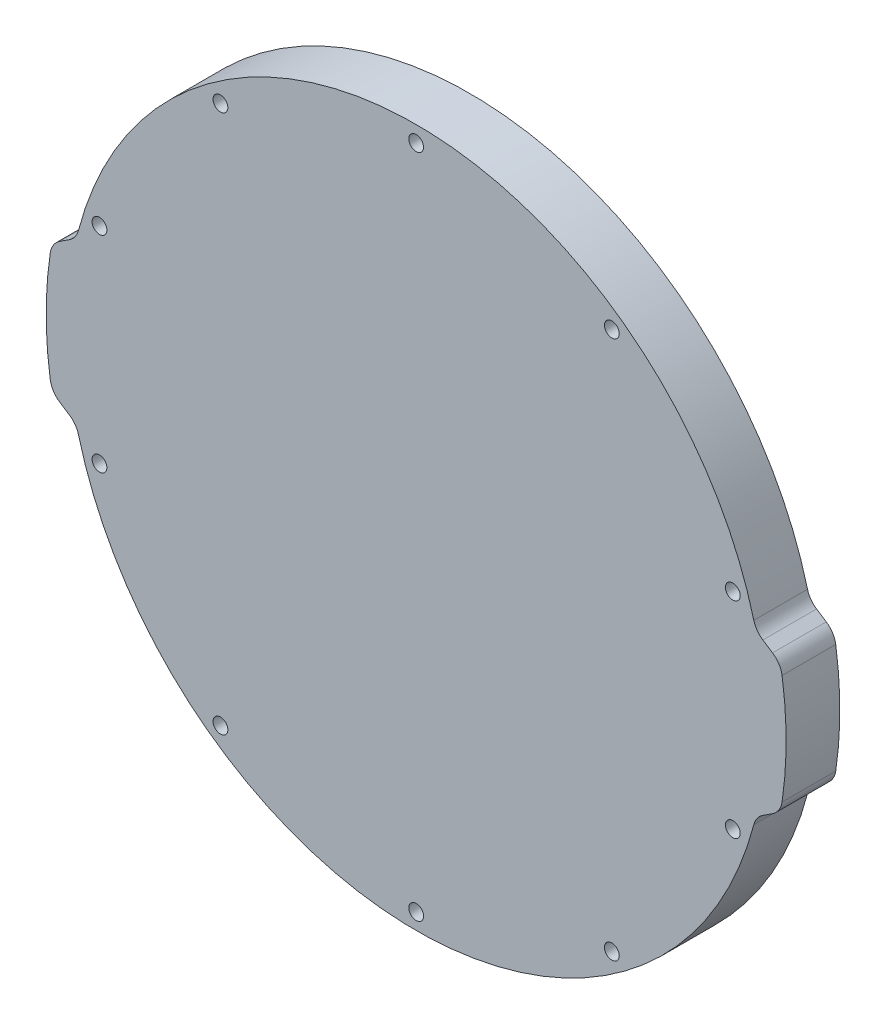
ISO-10303-21;
HEADER;
FILE_DESCRIPTION(('STEP AP214'),'2;1');
FILE_NAME('part.step','',(''),(''),'','','');
FILE_SCHEMA(('AUTOMOTIVE_DESIGN { 1 0 10303 214 1 1 1 1 }'));
ENDSEC;
DATA;
#1=APPLICATION_CONTEXT('core data for automotive mechanical design processes');
#2=APPLICATION_PROTOCOL_DEFINITION('international standard','automotive_design',2000,#1);
#3=PRODUCT_CONTEXT('',#1,'mechanical');
#4=PRODUCT('Part','Part','',(#3));
#5=PRODUCT_RELATED_PRODUCT_CATEGORY('part','',(#4));
#6=PRODUCT_DEFINITION_FORMATION('','',#4);
#7=PRODUCT_DEFINITION_CONTEXT('part definition',#1,'design');
#8=PRODUCT_DEFINITION('design','',#6,#7);
#9=PRODUCT_DEFINITION_SHAPE('','',#8);
#10=(LENGTH_UNIT() NAMED_UNIT(*) SI_UNIT(.MILLI.,.METRE.));
#11=(NAMED_UNIT(*) PLANE_ANGLE_UNIT() SI_UNIT($,.RADIAN.));
#12=(NAMED_UNIT(*) SI_UNIT($,.STERADIAN.) SOLID_ANGLE_UNIT());
#13=UNCERTAINTY_MEASURE_WITH_UNIT(LENGTH_MEASURE(1.E-05),#10,'distance_accuracy_value','');
#14=(GEOMETRIC_REPRESENTATION_CONTEXT(3) GLOBAL_UNCERTAINTY_ASSIGNED_CONTEXT((#13)) GLOBAL_UNIT_ASSIGNED_CONTEXT((#10,
#11,#12)) REPRESENTATION_CONTEXT('',''));
#15=CARTESIAN_POINT('',(0.,0.,0.));
#16=DIRECTION('',(0.,0.,1.));
#17=DIRECTION('',(1.,0.,0.));
#18=AXIS2_PLACEMENT_3D('',#15,#16,#17);
#19=CARTESIAN_POINT('',(0.,78.74,6.35));
#20=DIRECTION('',(0.,0.,-1.));
#21=DIRECTION('',(-1.,0.,0.));
#22=AXIS2_PLACEMENT_3D('',#19,#20,#21);
#23=CYLINDRICAL_SURFACE('',#22,1.75);
#24=CARTESIAN_POINT('',(0.,78.74,6.35));
#25=DIRECTION('',(0.,0.,1.));
#26=DIRECTION('',(1.,0.,0.));
#27=AXIS2_PLACEMENT_3D('',#24,#25,#26);
#28=CIRCLE('',#27,1.75);
#29=CARTESIAN_POINT('',(1.75,78.74,6.35));
#30=VERTEX_POINT('',#29);
#31=EDGE_CURVE('E242',#30,#30,#28,.T.);
#32=ORIENTED_EDGE('',*,*,#31,.T.);
#33=EDGE_LOOP('',(#32));
#34=FACE_BOUND('',#33,.T.);
#35=CARTESIAN_POINT('',(0.,78.74,-6.35));
#36=DIRECTION('',(0.,0.,1.));
#37=DIRECTION('',(1.,0.,0.));
#38=AXIS2_PLACEMENT_3D('',#35,#36,#37);
#39=CIRCLE('',#38,1.75);
#40=CARTESIAN_POINT('',(1.75,78.74,-6.35));
#41=VERTEX_POINT('',#40);
#42=EDGE_CURVE('E238',#41,#41,#39,.T.);
#43=ORIENTED_EDGE('',*,*,#42,.F.);
#44=EDGE_LOOP('',(#43));
#45=FACE_BOUND('',#44,.T.);
#46=ADVANCED_FACE('F65',(#34,#45),#23,.F.);
#47=CARTESIAN_POINT('',(46.2822107655093,63.7019981370834,6.35));
#48=DIRECTION('',(0.,0.,-1.));
#49=DIRECTION('',(-1.,0.,0.));
#50=AXIS2_PLACEMENT_3D('',#47,#48,#49);
#51=CYLINDRICAL_SURFACE('',#50,1.75000000000012);
#52=CARTESIAN_POINT('',(46.2822107655093,63.7019981370834,6.35));
#53=DIRECTION('',(0.,0.,1.));
#54=DIRECTION('',(1.,0.,0.));
#55=AXIS2_PLACEMENT_3D('',#52,#53,#54);
#56=CIRCLE('',#55,1.75000000000012);
#57=CARTESIAN_POINT('',(48.0322107655095,63.7019981370834,6.35));
#58=VERTEX_POINT('',#57);
#59=EDGE_CURVE('E349',#58,#58,#56,.T.);
#60=ORIENTED_EDGE('',*,*,#59,.T.);
#61=EDGE_LOOP('',(#60));
#62=FACE_BOUND('',#61,.T.);
#63=CARTESIAN_POINT('',(46.2822107655093,63.7019981370834,-6.35));
#64=DIRECTION('',(0.,0.,1.));
#65=DIRECTION('',(1.,0.,0.));
#66=AXIS2_PLACEMENT_3D('',#63,#64,#65);
#67=CIRCLE('',#66,1.75000000000012);
#68=CARTESIAN_POINT('',(48.0322107655095,63.7019981370834,-6.35));
#69=VERTEX_POINT('',#68);
#70=EDGE_CURVE('E235',#69,#69,#67,.T.);
#71=ORIENTED_EDGE('',*,*,#70,.F.);
#72=EDGE_LOOP('',(#71));
#73=FACE_BOUND('',#72,.T.);
#74=ADVANCED_FACE('F421',(#62,#73),#51,.F.);
#75=CARTESIAN_POINT('',(74.8861900930804,24.3319981370834,6.35));
#76=DIRECTION('',(0.,0.,-1.));
#77=DIRECTION('',(-1.,0.,0.));
#78=AXIS2_PLACEMENT_3D('',#75,#76,#77);
#79=CYLINDRICAL_SURFACE('',#78,1.7500000000002);
#80=CARTESIAN_POINT('',(74.8861900930804,24.3319981370834,6.35));
#81=DIRECTION('',(0.,0.,1.));
#82=DIRECTION('',(1.,0.,0.));
#83=AXIS2_PLACEMENT_3D('',#80,#81,#82);
#84=CIRCLE('',#83,1.7500000000002);
#85=CARTESIAN_POINT('',(76.6361900930806,24.3319981370834,6.35));
#86=VERTEX_POINT('',#85);
#87=EDGE_CURVE('E346',#86,#86,#84,.T.);
#88=ORIENTED_EDGE('',*,*,#87,.T.);
#89=EDGE_LOOP('',(#88));
#90=FACE_BOUND('',#89,.T.);
#91=CARTESIAN_POINT('',(74.8861900930804,24.3319981370834,-6.35));
#92=DIRECTION('',(0.,0.,1.));
#93=DIRECTION('',(1.,0.,0.));
#94=AXIS2_PLACEMENT_3D('',#91,#92,#93);
#95=CIRCLE('',#94,1.7500000000002);
#96=CARTESIAN_POINT('',(76.6361900930806,24.3319981370834,-6.35));
#97=VERTEX_POINT('',#96);
#98=EDGE_CURVE('E232',#97,#97,#95,.T.);
#99=ORIENTED_EDGE('',*,*,#98,.F.);
#100=EDGE_LOOP('',(#99));
#101=FACE_BOUND('',#100,.T.);
#102=ADVANCED_FACE('F427',(#90,#101),#79,.F.);
#103=CARTESIAN_POINT('',(74.8861900930804,-24.3319981370834,6.35));
#104=DIRECTION('',(0.,0.,-1.));
#105=DIRECTION('',(-1.,0.,0.));
#106=AXIS2_PLACEMENT_3D('',#103,#104,#105);
#107=CYLINDRICAL_SURFACE('',#106,1.75000000000031);
#108=CARTESIAN_POINT('',(74.8861900930804,-24.3319981370834,6.35));
#109=DIRECTION('',(0.,0.,1.));
#110=DIRECTION('',(1.,0.,0.));
#111=AXIS2_PLACEMENT_3D('',#108,#109,#110);
#112=CIRCLE('',#111,1.75000000000031);
#113=CARTESIAN_POINT('',(76.6361900930807,-24.3319981370834,6.35));
#114=VERTEX_POINT('',#113);
#115=EDGE_CURVE('E343',#114,#114,#112,.T.);
#116=ORIENTED_EDGE('',*,*,#115,.T.);
#117=EDGE_LOOP('',(#116));
#118=FACE_BOUND('',#117,.T.);
#119=CARTESIAN_POINT('',(74.8861900930804,-24.3319981370834,-6.35));
#120=DIRECTION('',(0.,0.,1.));
#121=DIRECTION('',(1.,0.,0.));
#122=AXIS2_PLACEMENT_3D('',#119,#120,#121);
#123=CIRCLE('',#122,1.75000000000031);
#124=CARTESIAN_POINT('',(76.6361900930807,-24.3319981370834,-6.35));
#125=VERTEX_POINT('',#124);
#126=EDGE_CURVE('E229',#125,#125,#123,.T.);
#127=ORIENTED_EDGE('',*,*,#126,.F.);
#128=EDGE_LOOP('',(#127));
#129=FACE_BOUND('',#128,.T.);
#130=ADVANCED_FACE('F436',(#118,#129),#107,.F.);
#131=CARTESIAN_POINT('',(46.2822107655093,-63.7019981370834,6.35));
#132=DIRECTION('',(0.,0.,-1.));
#133=DIRECTION('',(-1.,0.,0.));
#134=AXIS2_PLACEMENT_3D('',#131,#132,#133);
#135=CYLINDRICAL_SURFACE('',#134,1.7500000000004);
#136=CARTESIAN_POINT('',(46.2822107655093,-63.7019981370834,6.35));
#137=DIRECTION('',(0.,0.,1.));
#138=DIRECTION('',(1.,0.,0.));
#139=AXIS2_PLACEMENT_3D('',#136,#137,#138);
#140=CIRCLE('',#139,1.7500000000004);
#141=CARTESIAN_POINT('',(48.0322107655098,-63.7019981370834,6.35));
#142=VERTEX_POINT('',#141);
#143=EDGE_CURVE('E340',#142,#142,#140,.T.);
#144=ORIENTED_EDGE('',*,*,#143,.T.);
#145=EDGE_LOOP('',(#144));
#146=FACE_BOUND('',#145,.T.);
#147=CARTESIAN_POINT('',(46.2822107655093,-63.7019981370834,-6.35));
#148=DIRECTION('',(0.,0.,1.));
#149=DIRECTION('',(1.,0.,0.));
#150=AXIS2_PLACEMENT_3D('',#147,#148,#149);
#151=CIRCLE('',#150,1.7500000000004);
#152=CARTESIAN_POINT('',(48.0322107655098,-63.7019981370834,-6.35));
#153=VERTEX_POINT('',#152);
#154=EDGE_CURVE('E226',#153,#153,#151,.T.);
#155=ORIENTED_EDGE('',*,*,#154,.F.);
#156=EDGE_LOOP('',(#155));
#157=FACE_BOUND('',#156,.T.);
#158=ADVANCED_FACE('F440',(#146,#157),#135,.F.);
#159=CARTESIAN_POINT('',(0.,-78.74,6.35));
#160=DIRECTION('',(0.,0.,-1.));
#161=DIRECTION('',(-1.,0.,0.));
#162=AXIS2_PLACEMENT_3D('',#159,#160,#161);
#163=CYLINDRICAL_SURFACE('',#162,1.75000000000052);
#164=CARTESIAN_POINT('',(0.,-78.74,6.35));
#165=DIRECTION('',(0.,0.,1.));
#166=DIRECTION('',(1.,0.,0.));
#167=AXIS2_PLACEMENT_3D('',#164,#165,#166);
#168=CIRCLE('',#167,1.75000000000052);
#169=CARTESIAN_POINT('',(1.75000000000052,-78.74,6.35));
#170=VERTEX_POINT('',#169);
#171=EDGE_CURVE('E337',#170,#170,#168,.T.);
#172=ORIENTED_EDGE('',*,*,#171,.T.);
#173=EDGE_LOOP('',(#172));
#174=FACE_BOUND('',#173,.T.);
#175=CARTESIAN_POINT('',(0.,-78.74,-6.35));
#176=DIRECTION('',(0.,0.,1.));
#177=DIRECTION('',(1.,0.,0.));
#178=AXIS2_PLACEMENT_3D('',#175,#176,#177);
#179=CIRCLE('',#178,1.75000000000052);
#180=CARTESIAN_POINT('',(1.75000000000052,-78.74,-6.35));
#181=VERTEX_POINT('',#180);
#182=EDGE_CURVE('E223',#181,#181,#179,.T.);
#183=ORIENTED_EDGE('',*,*,#182,.F.);
#184=EDGE_LOOP('',(#183));
#185=FACE_BOUND('',#184,.T.);
#186=ADVANCED_FACE('F444',(#174,#185),#163,.F.);
#187=CARTESIAN_POINT('',(-46.2822107655094,-63.7019981370834,6.35));
#188=DIRECTION('',(0.,0.,-1.));
#189=DIRECTION('',(-1.,0.,0.));
#190=AXIS2_PLACEMENT_3D('',#187,#188,#189);
#191=CYLINDRICAL_SURFACE('',#190,1.75000000000063);
#192=CARTESIAN_POINT('',(-46.2822107655094,-63.7019981370834,6.35));
#193=DIRECTION('',(0.,0.,1.));
#194=DIRECTION('',(1.,0.,0.));
#195=AXIS2_PLACEMENT_3D('',#192,#193,#194);
#196=CIRCLE('',#195,1.75000000000063);
#197=CARTESIAN_POINT('',(-44.5322107655087,-63.7019981370834,6.35));
#198=VERTEX_POINT('',#197);
#199=EDGE_CURVE('E334',#198,#198,#196,.T.);
#200=ORIENTED_EDGE('',*,*,#199,.T.);
#201=EDGE_LOOP('',(#200));
#202=FACE_BOUND('',#201,.T.);
#203=CARTESIAN_POINT('',(-46.2822107655094,-63.7019981370834,-6.35));
#204=DIRECTION('',(0.,0.,1.));
#205=DIRECTION('',(1.,0.,0.));
#206=AXIS2_PLACEMENT_3D('',#203,#204,#205);
#207=CIRCLE('',#206,1.75000000000063);
#208=CARTESIAN_POINT('',(-44.5322107655087,-63.7019981370834,-6.35));
#209=VERTEX_POINT('',#208);
#210=EDGE_CURVE('E220',#209,#209,#207,.T.);
#211=ORIENTED_EDGE('',*,*,#210,.F.);
#212=EDGE_LOOP('',(#211));
#213=FACE_BOUND('',#212,.T.);
#214=ADVANCED_FACE('F448',(#202,#213),#191,.F.);
#215=CARTESIAN_POINT('',(-74.8861900930804,-24.3319981370834,6.35));
#216=DIRECTION('',(0.,0.,-1.));
#217=DIRECTION('',(-1.,0.,0.));
#218=AXIS2_PLACEMENT_3D('',#215,#216,#217);
#219=CYLINDRICAL_SURFACE('',#218,1.75000000000072);
#220=CARTESIAN_POINT('',(-74.8861900930804,-24.3319981370834,6.35));
#221=DIRECTION('',(0.,0.,1.));
#222=DIRECTION('',(1.,0.,0.));
#223=AXIS2_PLACEMENT_3D('',#220,#221,#222);
#224=CIRCLE('',#223,1.75000000000072);
#225=CARTESIAN_POINT('',(-73.1361900930797,-24.3319981370834,6.35));
#226=VERTEX_POINT('',#225);
#227=EDGE_CURVE('E331',#226,#226,#224,.T.);
#228=ORIENTED_EDGE('',*,*,#227,.T.);
#229=EDGE_LOOP('',(#228));
#230=FACE_BOUND('',#229,.T.);
#231=CARTESIAN_POINT('',(-74.8861900930804,-24.3319981370834,-6.35));
#232=DIRECTION('',(0.,0.,1.));
#233=DIRECTION('',(1.,0.,0.));
#234=AXIS2_PLACEMENT_3D('',#231,#232,#233);
#235=CIRCLE('',#234,1.75000000000072);
#236=CARTESIAN_POINT('',(-73.1361900930797,-24.3319981370834,-6.35));
#237=VERTEX_POINT('',#236);
#238=EDGE_CURVE('E217',#237,#237,#235,.T.);
#239=ORIENTED_EDGE('',*,*,#238,.F.);
#240=EDGE_LOOP('',(#239));
#241=FACE_BOUND('',#240,.T.);
#242=ADVANCED_FACE('F452',(#230,#241),#219,.F.);
#243=CARTESIAN_POINT('',(-74.8861900930804,24.3319981370833,6.35));
#244=DIRECTION('',(0.,0.,-1.));
#245=DIRECTION('',(-1.,0.,0.));
#246=AXIS2_PLACEMENT_3D('',#243,#244,#245);
#247=CYLINDRICAL_SURFACE('',#246,1.75000000000087);
#248=CARTESIAN_POINT('',(-74.8861900930804,24.3319981370833,6.35));
#249=DIRECTION('',(0.,0.,1.));
#250=DIRECTION('',(1.,0.,0.));
#251=AXIS2_PLACEMENT_3D('',#248,#249,#250);
#252=CIRCLE('',#251,1.75000000000087);
#253=CARTESIAN_POINT('',(-73.1361900930795,24.3319981370833,6.35));
#254=VERTEX_POINT('',#253);
#255=EDGE_CURVE('E328',#254,#254,#252,.T.);
#256=ORIENTED_EDGE('',*,*,#255,.T.);
#257=EDGE_LOOP('',(#256));
#258=FACE_BOUND('',#257,.T.);
#259=CARTESIAN_POINT('',(-74.8861900930804,24.3319981370833,-6.35));
#260=DIRECTION('',(0.,0.,1.));
#261=DIRECTION('',(1.,0.,0.));
#262=AXIS2_PLACEMENT_3D('',#259,#260,#261);
#263=CIRCLE('',#262,1.75000000000087);
#264=CARTESIAN_POINT('',(-73.1361900930795,24.3319981370833,-6.35));
#265=VERTEX_POINT('',#264);
#266=EDGE_CURVE('E209',#265,#265,#263,.T.);
#267=ORIENTED_EDGE('',*,*,#266,.F.);
#268=EDGE_LOOP('',(#267));
#269=FACE_BOUND('',#268,.T.);
#270=ADVANCED_FACE('F456',(#258,#269),#247,.F.);
#271=CARTESIAN_POINT('',(-46.2822107655094,63.7019981370833,6.35));
#272=DIRECTION('',(0.,0.,-1.));
#273=DIRECTION('',(-1.,0.,0.));
#274=AXIS2_PLACEMENT_3D('',#271,#272,#273);
#275=CYLINDRICAL_SURFACE('',#274,1.75000000000102);
#276=CARTESIAN_POINT('',(-46.2822107655094,63.7019981370833,6.35));
#277=DIRECTION('',(0.,0.,1.));
#278=DIRECTION('',(1.,0.,0.));
#279=AXIS2_PLACEMENT_3D('',#276,#277,#278);
#280=CIRCLE('',#279,1.75000000000102);
#281=CARTESIAN_POINT('',(-44.5322107655083,63.7019981370833,6.35));
#282=VERTEX_POINT('',#281);
#283=EDGE_CURVE('E325',#282,#282,#280,.T.);
#284=ORIENTED_EDGE('',*,*,#283,.T.);
#285=EDGE_LOOP('',(#284));
#286=FACE_BOUND('',#285,.T.);
#287=CARTESIAN_POINT('',(-46.2822107655094,63.7019981370833,-6.35));
#288=DIRECTION('',(0.,0.,1.));
#289=DIRECTION('',(1.,0.,0.));
#290=AXIS2_PLACEMENT_3D('',#287,#288,#289);
#291=CIRCLE('',#290,1.75000000000102);
#292=CARTESIAN_POINT('',(-44.5322107655083,63.7019981370833,-6.35));
#293=VERTEX_POINT('',#292);
#294=EDGE_CURVE('E205',#293,#293,#291,.T.);
#295=ORIENTED_EDGE('',*,*,#294,.F.);
#296=EDGE_LOOP('',(#295));
#297=FACE_BOUND('',#296,.T.);
#298=ADVANCED_FACE('F460',(#286,#297),#275,.F.);
#299=CARTESIAN_POINT('',(0.,0.,6.35));
#300=DIRECTION('',(0.,0.,-1.));
#301=DIRECTION('',(-1.,0.,0.));
#302=AXIS2_PLACEMENT_3D('',#299,#300,#301);
#303=CYLINDRICAL_SURFACE('',#302,82.55);
#304=CARTESIAN_POINT('',(0.,0.,6.35));
#305=DIRECTION('',(0.,0.,1.));
#306=DIRECTION('',(1.,0.,0.));
#307=AXIS2_PLACEMENT_3D('',#304,#305,#306);
#308=CIRCLE('',#307,82.55);
#309=CARTESIAN_POINT('',(-79.8532293480117,-20.92759572177,6.35));
#310=VERTEX_POINT('',#309);
#311=CARTESIAN_POINT('',(79.8532293480117,-20.92759572177,6.35));
#312=VERTEX_POINT('',#311);
#313=EDGE_CURVE('E381',#310,#312,#308,.T.);
#314=ORIENTED_EDGE('',*,*,#313,.F.);
#315=DIRECTION('',(0.,0.,-1.));
#316=VECTOR('',#315,1.);
#317=CARTESIAN_POINT('',(-79.8532293480117,-20.92759572177,6.35));
#318=LINE('',#317,#316);
#319=CARTESIAN_POINT('',(-79.8532293480117,-20.92759572177,-6.35));
#320=VERTEX_POINT('',#319);
#321=EDGE_CURVE('E270',#310,#320,#318,.T.);
#322=ORIENTED_EDGE('',*,*,#321,.T.);
#323=CARTESIAN_POINT('',(0.,0.,-6.35));
#324=DIRECTION('',(0.,0.,1.));
#325=DIRECTION('',(1.,0.,0.));
#326=AXIS2_PLACEMENT_3D('',#323,#324,#325);
#327=CIRCLE('',#326,82.55);
#328=CARTESIAN_POINT('',(79.8532293480117,-20.92759572177,-6.35));
#329=VERTEX_POINT('',#328);
#330=EDGE_CURVE('E357',#320,#329,#327,.T.);
#331=ORIENTED_EDGE('',*,*,#330,.T.);
#332=DIRECTION('',(0.,0.,-1.));
#333=VECTOR('',#332,1.);
#334=CARTESIAN_POINT('',(79.8532293480117,-20.92759572177,6.35));
#335=LINE('',#334,#333);
#336=EDGE_CURVE('E268',#329,#312,#335,.F.);
#337=ORIENTED_EDGE('',*,*,#336,.T.);
#338=EDGE_LOOP('',(#314,#322,#331,#337));
#339=FACE_BOUND('',#338,.T.);
#340=ADVANCED_FACE('F399',(#339),#303,.T.);
#341=CARTESIAN_POINT('',(32.6932461479969,-50.1188342409814,6.35));
#342=DIRECTION('',(0.54635043510257,-0.837556685880563,0.));
#343=DIRECTION('',(0.837556685880563,0.54635043510257,0.));
#344=AXIS2_PLACEMENT_3D('',#341,#342,#343);
#345=PLANE('',#344);
#346=DIRECTION('',(-0.837556685880564,-0.54635043510257,0.));
#347=VECTOR('',#346,1.);
#348=CARTESIAN_POINT('',(32.6932461479969,-50.1188342409814,-6.35));
#349=LINE('',#348,#347);
#350=CARTESIAN_POINT('',(84.2861379976627,-16.4640388277856,-6.35));
#351=VERTEX_POINT('',#350);
#352=CARTESIAN_POINT('',(81.9918140206452,-17.9606598019133,-6.35));
#353=VERTEX_POINT('',#352);
#354=EDGE_CURVE('E360',#351,#353,#349,.T.);
#355=ORIENTED_EDGE('',*,*,#354,.F.);
#356=DIRECTION('',(0.,0.,1.));
#357=VECTOR('',#356,1.);
#358=CARTESIAN_POINT('',(84.2861379976626,-16.4640388277856,6.35));
#359=LINE('',#358,#357);
#360=CARTESIAN_POINT('',(84.2861379976627,-16.4640388277856,6.35));
#361=VERTEX_POINT('',#360);
#362=EDGE_CURVE('E281',#351,#361,#359,.T.);
#363=ORIENTED_EDGE('',*,*,#362,.T.);
#364=DIRECTION('',(-0.837556685880564,-0.54635043510257,0.));
#365=VECTOR('',#364,1.);
#366=CARTESIAN_POINT('',(32.6932461479969,-50.1188342409814,6.35));
#367=LINE('',#366,#365);
#368=CARTESIAN_POINT('',(81.9918140206452,-17.9606598019133,6.35));
#369=VERTEX_POINT('',#368);
#370=EDGE_CURVE('E379',#361,#369,#367,.T.);
#371=ORIENTED_EDGE('',*,*,#370,.T.);
#372=DIRECTION('',(0.,0.,-1.));
#373=VECTOR('',#372,1.);
#374=CARTESIAN_POINT('',(81.9918140206452,-17.9606598019133,6.35));
#375=LINE('',#374,#373);
#376=EDGE_CURVE('E278',#369,#353,#375,.T.);
#377=ORIENTED_EDGE('',*,*,#376,.T.);
#378=EDGE_LOOP('',(#355,#363,#371,#377));
#379=FACE_BOUND('',#378,.T.);
#380=ADVANCED_FACE('F407',(#379),#345,.T.);
#381=CARTESIAN_POINT('',(0.,0.,6.35));
#382=DIRECTION('',(0.,0.,-1.));
#383=DIRECTION('',(-1.,0.,0.));
#384=AXIS2_PLACEMENT_3D('',#381,#382,#383);
#385=CYLINDRICAL_SURFACE('',#384,87.5);
#386=CARTESIAN_POINT('',(0.,0.,6.35));
#387=DIRECTION('',(0.,0.,1.));
#388=DIRECTION('',(1.,0.,0.));
#389=AXIS2_PLACEMENT_3D('',#386,#387,#388);
#390=CIRCLE('',#389,87.5);
#391=CARTESIAN_POINT('',(86.5346312350448,-12.9617744547116,6.35));
#392=VERTEX_POINT('',#391);
#393=CARTESIAN_POINT('',(86.5346312350448,12.9617744547116,6.35));
#394=VERTEX_POINT('',#393);
#395=EDGE_CURVE('E320',#392,#394,#390,.T.);
#396=ORIENTED_EDGE('',*,*,#395,.F.);
#397=DIRECTION('',(0.,0.,-1.));
#398=VECTOR('',#397,1.);
#399=CARTESIAN_POINT('',(86.5346312350448,-12.9617744547116,6.35));
#400=LINE('',#399,#398);
#401=CARTESIAN_POINT('',(86.5346312350448,-12.9617744547116,-6.35));
#402=VERTEX_POINT('',#401);
#403=EDGE_CURVE('E275',#392,#402,#400,.T.);
#404=ORIENTED_EDGE('',*,*,#403,.T.);
#405=CARTESIAN_POINT('',(0.,0.,-6.35));
#406=DIRECTION('',(0.,0.,1.));
#407=DIRECTION('',(1.,0.,0.));
#408=AXIS2_PLACEMENT_3D('',#405,#406,#407);
#409=CIRCLE('',#408,87.5);
#410=CARTESIAN_POINT('',(86.5346312350448,12.9617744547116,-6.35));
#411=VERTEX_POINT('',#410);
#412=EDGE_CURVE('E310',#402,#411,#409,.T.);
#413=ORIENTED_EDGE('',*,*,#412,.T.);
#414=DIRECTION('',(0.,0.,-1.));
#415=VECTOR('',#414,1.);
#416=CARTESIAN_POINT('',(86.5346312350448,12.9617744547116,6.35));
#417=LINE('',#416,#415);
#418=EDGE_CURVE('E273',#411,#394,#417,.F.);
#419=ORIENTED_EDGE('',*,*,#418,.T.);
#420=EDGE_LOOP('',(#396,#404,#413,#419));
#421=FACE_BOUND('',#420,.T.);
#422=ADVANCED_FACE('F368',(#421),#385,.T.);
#423=CARTESIAN_POINT('',(32.6932461479969,50.1188342409814,6.35));
#424=DIRECTION('',(-0.54635043510257,-0.837556685880563,0.));
#425=DIRECTION('',(0.837556685880563,-0.54635043510257,0.));
#426=AXIS2_PLACEMENT_3D('',#423,#424,#425);
#427=PLANE('',#426);
#428=DIRECTION('',(-0.837556685880564,0.54635043510257,0.));
#429=VECTOR('',#428,1.);
#430=CARTESIAN_POINT('',(32.6932461479969,50.1188342409814,6.35));
#431=LINE('',#430,#429);
#432=CARTESIAN_POINT('',(84.2861379976627,16.4640388277856,6.35));
#433=VERTEX_POINT('',#432);
#434=CARTESIAN_POINT('',(81.9918140206452,17.9606598019133,6.35));
#435=VERTEX_POINT('',#434);
#436=EDGE_CURVE('E316',#433,#435,#431,.T.);
#437=ORIENTED_EDGE('',*,*,#436,.F.);
#438=DIRECTION('',(0.,0.,-1.));
#439=VECTOR('',#438,1.);
#440=CARTESIAN_POINT('',(84.2861379976627,16.4640388277856,6.35));
#441=LINE('',#440,#439);
#442=CARTESIAN_POINT('',(84.2861379976627,16.4640388277856,-6.35));
#443=VERTEX_POINT('',#442);
#444=EDGE_CURVE('E285',#433,#443,#441,.T.);
#445=ORIENTED_EDGE('',*,*,#444,.T.);
#446=DIRECTION('',(-0.837556685880564,0.54635043510257,0.));
#447=VECTOR('',#446,1.);
#448=CARTESIAN_POINT('',(32.6932461479969,50.1188342409814,-6.35));
#449=LINE('',#448,#447);
#450=CARTESIAN_POINT('',(81.9918140206452,17.9606598019133,-6.35));
#451=VERTEX_POINT('',#450);
#452=EDGE_CURVE('E302',#443,#451,#449,.T.);
#453=ORIENTED_EDGE('',*,*,#452,.T.);
#454=DIRECTION('',(0.,0.,1.));
#455=VECTOR('',#454,1.);
#456=CARTESIAN_POINT('',(81.9918140206452,17.9606598019133,6.35));
#457=LINE('',#456,#455);
#458=EDGE_CURVE('E283',#451,#435,#457,.T.);
#459=ORIENTED_EDGE('',*,*,#458,.T.);
#460=EDGE_LOOP('',(#437,#445,#453,#459));
#461=FACE_BOUND('',#460,.T.);
#462=ADVANCED_FACE('F308',(#461),#427,.F.);
#463=CARTESIAN_POINT('',(0.,0.,6.35));
#464=DIRECTION('',(0.,0.,-1.));
#465=DIRECTION('',(-1.,0.,0.));
#466=AXIS2_PLACEMENT_3D('',#463,#464,#465);
#467=CYLINDRICAL_SURFACE('',#466,82.55);
#468=CARTESIAN_POINT('',(0.,0.,-6.35));
#469=DIRECTION('',(0.,0.,1.));
#470=DIRECTION('',(1.,0.,0.));
#471=AXIS2_PLACEMENT_3D('',#468,#469,#470);
#472=CIRCLE('',#471,82.55);
#473=CARTESIAN_POINT('',(79.8532293480117,20.92759572177,-6.35));
#474=VERTEX_POINT('',#473);
#475=CARTESIAN_POINT('',(-79.8532293480117,20.92759572177,-6.35));
#476=VERTEX_POINT('',#475);
#477=EDGE_CURVE('E211',#474,#476,#472,.T.);
#478=ORIENTED_EDGE('',*,*,#477,.T.);
#479=DIRECTION('',(0.,0.,-1.));
#480=VECTOR('',#479,1.);
#481=CARTESIAN_POINT('',(-79.8532293480117,20.92759572177,6.35));
#482=LINE('',#481,#480);
#483=CARTESIAN_POINT('',(-79.8532293480117,20.92759572177,6.35));
#484=VERTEX_POINT('',#483);
#485=EDGE_CURVE('E80',#476,#484,#482,.F.);
#486=ORIENTED_EDGE('',*,*,#485,.T.);
#487=CARTESIAN_POINT('',(0.,0.,6.35));
#488=DIRECTION('',(0.,0.,1.));
#489=DIRECTION('',(1.,0.,0.));
#490=AXIS2_PLACEMENT_3D('',#487,#488,#489);
#491=CIRCLE('',#490,82.55);
#492=CARTESIAN_POINT('',(79.8532293480117,20.92759572177,6.35));
#493=VERTEX_POINT('',#492);
#494=EDGE_CURVE('E313',#493,#484,#491,.T.);
#495=ORIENTED_EDGE('',*,*,#494,.F.);
#496=DIRECTION('',(0.,0.,-1.));
#497=VECTOR('',#496,1.);
#498=CARTESIAN_POINT('',(79.8532293480117,20.92759572177,6.35));
#499=LINE('',#498,#497);
#500=EDGE_CURVE('E259',#493,#474,#499,.T.);
#501=ORIENTED_EDGE('',*,*,#500,.T.);
#502=EDGE_LOOP('',(#478,#486,#495,#501));
#503=FACE_BOUND('',#502,.T.);
#504=ADVANCED_FACE('F312',(#503),#467,.T.);
#505=CARTESIAN_POINT('',(-32.6932461479969,50.1188342409814,6.35));
#506=DIRECTION('',(-0.54635043510257,0.837556685880563,0.));
#507=DIRECTION('',(-0.837556685880563,-0.54635043510257,0.));
#508=AXIS2_PLACEMENT_3D('',#505,#506,#507);
#509=PLANE('',#508);
#510=DIRECTION('',(0.837556685880564,0.54635043510257,0.));
#511=VECTOR('',#510,1.);
#512=CARTESIAN_POINT('',(-32.6932461479969,50.1188342409814,-6.35));
#513=LINE('',#512,#511);
#514=CARTESIAN_POINT('',(-84.2861379976627,16.4640388277856,-6.35));
#515=VERTEX_POINT('',#514);
#516=CARTESIAN_POINT('',(-81.9918140206452,17.9606598019133,-6.35));
#517=VERTEX_POINT('',#516);
#518=EDGE_CURVE('E206',#515,#517,#513,.T.);
#519=ORIENTED_EDGE('',*,*,#518,.F.);
#520=DIRECTION('',(0.,0.,1.));
#521=VECTOR('',#520,1.);
#522=CARTESIAN_POINT('',(-84.2861379976626,16.4640388277856,6.35));
#523=LINE('',#522,#521);
#524=CARTESIAN_POINT('',(-84.2861379976627,16.4640388277856,6.35));
#525=VERTEX_POINT('',#524);
#526=EDGE_CURVE('E183',#515,#525,#523,.T.);
#527=ORIENTED_EDGE('',*,*,#526,.T.);
#528=DIRECTION('',(0.837556685880564,0.54635043510257,0.));
#529=VECTOR('',#528,1.);
#530=CARTESIAN_POINT('',(-32.6932461479969,50.1188342409814,6.35));
#531=LINE('',#530,#529);
#532=CARTESIAN_POINT('',(-81.9918140206452,17.9606598019133,6.35));
#533=VERTEX_POINT('',#532);
#534=EDGE_CURVE('E315',#525,#533,#531,.T.);
#535=ORIENTED_EDGE('',*,*,#534,.T.);
#536=DIRECTION('',(0.,0.,-1.));
#537=VECTOR('',#536,1.);
#538=CARTESIAN_POINT('',(-81.9918140206452,17.9606598019133,6.35));
#539=LINE('',#538,#537);
#540=EDGE_CURVE('E188',#533,#517,#539,.T.);
#541=ORIENTED_EDGE('',*,*,#540,.T.);
#542=EDGE_LOOP('',(#519,#527,#535,#541));
#543=FACE_BOUND('',#542,.T.);
#544=ADVANCED_FACE('F468',(#543),#509,.T.);
#545=CARTESIAN_POINT('',(0.,0.,6.35));
#546=DIRECTION('',(0.,0.,-1.));
#547=DIRECTION('',(-1.,0.,0.));
#548=AXIS2_PLACEMENT_3D('',#545,#546,#547);
#549=CYLINDRICAL_SURFACE('',#548,87.5);
#550=CARTESIAN_POINT('',(0.,0.,6.35));
#551=DIRECTION('',(0.,0.,1.));
#552=DIRECTION('',(1.,0.,0.));
#553=AXIS2_PLACEMENT_3D('',#550,#551,#552);
#554=CIRCLE('',#553,87.5);
#555=CARTESIAN_POINT('',(-86.5346312350448,12.9617744547116,6.35));
#556=VERTEX_POINT('',#555);
#557=CARTESIAN_POINT('',(-86.5346312350448,-12.9617744547116,6.35));
#558=VERTEX_POINT('',#557);
#559=EDGE_CURVE('E198',#556,#558,#554,.T.);
#560=ORIENTED_EDGE('',*,*,#559,.F.);
#561=DIRECTION('',(0.,0.,-1.));
#562=VECTOR('',#561,1.);
#563=CARTESIAN_POINT('',(-86.5346312350448,12.9617744547116,6.35));
#564=LINE('',#563,#562);
#565=CARTESIAN_POINT('',(-86.5346312350448,12.9617744547116,-6.35));
#566=VERTEX_POINT('',#565);
#567=EDGE_CURVE('E182',#556,#566,#564,.T.);
#568=ORIENTED_EDGE('',*,*,#567,.T.);
#569=CARTESIAN_POINT('',(0.,0.,-6.35));
#570=DIRECTION('',(0.,0.,1.));
#571=DIRECTION('',(1.,0.,0.));
#572=AXIS2_PLACEMENT_3D('',#569,#570,#571);
#573=CIRCLE('',#572,87.5);
#574=CARTESIAN_POINT('',(-86.5346312350448,-12.9617744547116,-6.35));
#575=VERTEX_POINT('',#574);
#576=EDGE_CURVE('E195',#566,#575,#573,.T.);
#577=ORIENTED_EDGE('',*,*,#576,.T.);
#578=DIRECTION('',(0.,0.,-1.));
#579=VECTOR('',#578,1.);
#580=CARTESIAN_POINT('',(-86.5346312350448,-12.9617744547116,6.35));
#581=LINE('',#580,#579);
#582=EDGE_CURVE('E200',#575,#558,#581,.F.);
#583=ORIENTED_EDGE('',*,*,#582,.T.);
#584=EDGE_LOOP('',(#560,#568,#577,#583));
#585=FACE_BOUND('',#584,.T.);
#586=ADVANCED_FACE('F194',(#585),#549,.T.);
#587=CARTESIAN_POINT('',(-32.6932461479969,-50.1188342409814,6.35));
#588=DIRECTION('',(0.54635043510257,0.837556685880563,0.));
#589=DIRECTION('',(-0.837556685880563,0.54635043510257,0.));
#590=AXIS2_PLACEMENT_3D('',#587,#588,#589);
#591=PLANE('',#590);
#592=DIRECTION('',(0.837556685880564,-0.54635043510257,0.));
#593=VECTOR('',#592,1.);
#594=CARTESIAN_POINT('',(-32.6932461479969,-50.1188342409814,6.35));
#595=LINE('',#594,#593);
#596=CARTESIAN_POINT('',(-84.2861379976627,-16.4640388277856,6.35));
#597=VERTEX_POINT('',#596);
#598=CARTESIAN_POINT('',(-81.9918140206452,-17.9606598019133,6.35));
#599=VERTEX_POINT('',#598);
#600=EDGE_CURVE('E241',#597,#599,#595,.T.);
#601=ORIENTED_EDGE('',*,*,#600,.F.);
#602=DIRECTION('',(0.,0.,-1.));
#603=VECTOR('',#602,1.);
#604=CARTESIAN_POINT('',(-84.2861379976627,-16.4640388277856,6.35));
#605=LINE('',#604,#603);
#606=CARTESIAN_POINT('',(-84.2861379976627,-16.4640388277856,-6.35));
#607=VERTEX_POINT('',#606);
#608=EDGE_CURVE('E265',#597,#607,#605,.T.);
#609=ORIENTED_EDGE('',*,*,#608,.T.);
#610=DIRECTION('',(0.837556685880564,-0.54635043510257,0.));
#611=VECTOR('',#610,1.);
#612=CARTESIAN_POINT('',(-32.6932461479969,-50.1188342409814,-6.35));
#613=LINE('',#612,#611);
#614=CARTESIAN_POINT('',(-81.9918140206452,-17.9606598019133,-6.35));
#615=VERTEX_POINT('',#614);
#616=EDGE_CURVE('E354',#607,#615,#613,.T.);
#617=ORIENTED_EDGE('',*,*,#616,.T.);
#618=DIRECTION('',(0.,0.,1.));
#619=VECTOR('',#618,1.);
#620=CARTESIAN_POINT('',(-81.9918140206452,-17.9606598019133,6.35));
#621=LINE('',#620,#619);
#622=EDGE_CURVE('E263',#615,#599,#621,.T.);
#623=ORIENTED_EDGE('',*,*,#622,.T.);
#624=EDGE_LOOP('',(#601,#609,#617,#623));
#625=FACE_BOUND('',#624,.T.);
#626=ADVANCED_FACE('F467',(#625),#591,.F.);
#627=CARTESIAN_POINT('',(0.,0.,-6.35));
#628=DIRECTION('',(0.,0.,1.));
#629=DIRECTION('',(1.,0.,0.));
#630=AXIS2_PLACEMENT_3D('',#627,#628,#629);
#631=PLANE('',#630);
#632=ORIENTED_EDGE('',*,*,#576,.F.);
#633=CARTESIAN_POINT('',(-81.5106777873416,12.2092508635124,-6.35));
#634=DIRECTION('',(0.,0.,1.));
#635=DIRECTION('',(1.,0.,0.));
#636=AXIS2_PLACEMENT_3D('',#633,#634,#635);
#637=CIRCLE('',#636,5.08);
#638=EDGE_CURVE('E178',#566,#515,#637,.F.);
#639=ORIENTED_EDGE('',*,*,#638,.T.);
#640=ORIENTED_EDGE('',*,*,#518,.T.);
#641=CARTESIAN_POINT('',(-84.7672742309663,22.2154477661866,-6.35));
#642=DIRECTION('',(0.,0.,1.));
#643=DIRECTION('',(1.,0.,0.));
#644=AXIS2_PLACEMENT_3D('',#641,#642,#643);
#645=CIRCLE('',#644,5.08);
#646=EDGE_CURVE('E288',#517,#476,#645,.T.);
#647=ORIENTED_EDGE('',*,*,#646,.T.);
#648=ORIENTED_EDGE('',*,*,#477,.F.);
#649=CARTESIAN_POINT('',(84.7672742309663,22.2154477661866,-6.35));
#650=DIRECTION('',(0.,0.,1.));
#651=DIRECTION('',(1.,0.,0.));
#652=AXIS2_PLACEMENT_3D('',#649,#650,#651);
#653=CIRCLE('',#652,5.08);
#654=EDGE_CURVE('E73',#474,#451,#653,.T.);
#655=ORIENTED_EDGE('',*,*,#654,.T.);
#656=ORIENTED_EDGE('',*,*,#452,.F.);
#657=CARTESIAN_POINT('',(81.5106777873416,12.2092508635124,-6.35));
#658=DIRECTION('',(0.,0.,1.));
#659=DIRECTION('',(1.,0.,0.));
#660=AXIS2_PLACEMENT_3D('',#657,#658,#659);
#661=CIRCLE('',#660,5.08);
#662=EDGE_CURVE('E199',#443,#411,#661,.F.);
#663=ORIENTED_EDGE('',*,*,#662,.T.);
#664=ORIENTED_EDGE('',*,*,#412,.F.);
#665=CARTESIAN_POINT('',(81.5106777873416,-12.2092508635124,-6.35));
#666=DIRECTION('',(0.,0.,1.));
#667=DIRECTION('',(1.,0.,0.));
#668=AXIS2_PLACEMENT_3D('',#665,#666,#667);
#669=CIRCLE('',#668,5.08);
#670=EDGE_CURVE('E245',#402,#351,#669,.F.);
#671=ORIENTED_EDGE('',*,*,#670,.T.);
#672=ORIENTED_EDGE('',*,*,#354,.T.);
#673=CARTESIAN_POINT('',(84.7672742309663,-22.2154477661866,-6.35));
#674=DIRECTION('',(0.,0.,1.));
#675=DIRECTION('',(1.,0.,0.));
#676=AXIS2_PLACEMENT_3D('',#673,#674,#675);
#677=CIRCLE('',#676,5.08);
#678=EDGE_CURVE('E296',#353,#329,#677,.T.);
#679=ORIENTED_EDGE('',*,*,#678,.T.);
#680=ORIENTED_EDGE('',*,*,#330,.F.);
#681=CARTESIAN_POINT('',(-84.7672742309663,-22.2154477661866,-6.35));
#682=DIRECTION('',(0.,0.,1.));
#683=DIRECTION('',(1.,0.,0.));
#684=AXIS2_PLACEMENT_3D('',#681,#682,#683);
#685=CIRCLE('',#684,5.08);
#686=EDGE_CURVE('E292',#320,#615,#685,.T.);
#687=ORIENTED_EDGE('',*,*,#686,.T.);
#688=ORIENTED_EDGE('',*,*,#616,.F.);
#689=CARTESIAN_POINT('',(-81.5106777873416,-12.2092508635124,-6.35));
#690=DIRECTION('',(0.,0.,1.));
#691=DIRECTION('',(1.,0.,0.));
#692=AXIS2_PLACEMENT_3D('',#689,#690,#691);
#693=CIRCLE('',#692,5.08);
#694=EDGE_CURVE('E189',#607,#575,#693,.F.);
#695=ORIENTED_EDGE('',*,*,#694,.T.);
#696=EDGE_LOOP('',(#632,#639,#640,#647,#648,#655,#656,#663,#664,#671,#672,#679,#680,#687,#688,#695));
#697=FACE_BOUND('',#696,.T.);
#698=ORIENTED_EDGE('',*,*,#294,.T.);
#699=EDGE_LOOP('',(#698));
#700=FACE_BOUND('',#699,.T.);
#701=ORIENTED_EDGE('',*,*,#266,.T.);
#702=EDGE_LOOP('',(#701));
#703=FACE_BOUND('',#702,.T.);
#704=ORIENTED_EDGE('',*,*,#238,.T.);
#705=EDGE_LOOP('',(#704));
#706=FACE_BOUND('',#705,.T.);
#707=ORIENTED_EDGE('',*,*,#210,.T.);
#708=EDGE_LOOP('',(#707));
#709=FACE_BOUND('',#708,.T.);
#710=ORIENTED_EDGE('',*,*,#182,.T.);
#711=EDGE_LOOP('',(#710));
#712=FACE_BOUND('',#711,.T.);
#713=ORIENTED_EDGE('',*,*,#154,.T.);
#714=EDGE_LOOP('',(#713));
#715=FACE_BOUND('',#714,.T.);
#716=ORIENTED_EDGE('',*,*,#126,.T.);
#717=EDGE_LOOP('',(#716));
#718=FACE_BOUND('',#717,.T.);
#719=ORIENTED_EDGE('',*,*,#98,.T.);
#720=EDGE_LOOP('',(#719));
#721=FACE_BOUND('',#720,.T.);
#722=ORIENTED_EDGE('',*,*,#70,.T.);
#723=EDGE_LOOP('',(#722));
#724=FACE_BOUND('',#723,.T.);
#725=ORIENTED_EDGE('',*,*,#42,.T.);
#726=EDGE_LOOP('',(#725));
#727=FACE_BOUND('',#726,.T.);
#728=ADVANCED_FACE('F202',(#697,#700,#703,#706,#709,#712,#715,#718,#721,#724,#727),#631,.F.);
#729=CARTESIAN_POINT('',(0.,0.,6.35));
#730=DIRECTION('',(0.,0.,1.));
#731=DIRECTION('',(1.,0.,0.));
#732=AXIS2_PLACEMENT_3D('',#729,#730,#731);
#733=PLANE('',#732);
#734=ORIENTED_EDGE('',*,*,#534,.F.);
#735=CARTESIAN_POINT('',(-81.5106777873416,12.2092508635124,6.35));
#736=DIRECTION('',(0.,0.,1.));
#737=DIRECTION('',(1.,0.,0.));
#738=AXIS2_PLACEMENT_3D('',#735,#736,#737);
#739=CIRCLE('',#738,5.08);
#740=EDGE_CURVE('E257',#525,#556,#739,.T.);
#741=ORIENTED_EDGE('',*,*,#740,.T.);
#742=ORIENTED_EDGE('',*,*,#559,.T.);
#743=CARTESIAN_POINT('',(-81.5106777873416,-12.2092508635124,6.35));
#744=DIRECTION('',(0.,0.,1.));
#745=DIRECTION('',(1.,0.,0.));
#746=AXIS2_PLACEMENT_3D('',#743,#744,#745);
#747=CIRCLE('',#746,5.08);
#748=EDGE_CURVE('E255',#558,#597,#747,.T.);
#749=ORIENTED_EDGE('',*,*,#748,.T.);
#750=ORIENTED_EDGE('',*,*,#600,.T.);
#751=CARTESIAN_POINT('',(-84.7672742309663,-22.2154477661866,6.35));
#752=DIRECTION('',(0.,0.,1.));
#753=DIRECTION('',(1.,0.,0.));
#754=AXIS2_PLACEMENT_3D('',#751,#752,#753);
#755=CIRCLE('',#754,5.08);
#756=EDGE_CURVE('E294',#599,#310,#755,.F.);
#757=ORIENTED_EDGE('',*,*,#756,.T.);
#758=ORIENTED_EDGE('',*,*,#313,.T.);
#759=CARTESIAN_POINT('',(84.7672742309663,-22.2154477661866,6.35));
#760=DIRECTION('',(0.,0.,1.));
#761=DIRECTION('',(1.,0.,0.));
#762=AXIS2_PLACEMENT_3D('',#759,#760,#761);
#763=CIRCLE('',#762,5.08);
#764=EDGE_CURVE('E298',#312,#369,#763,.F.);
#765=ORIENTED_EDGE('',*,*,#764,.T.);
#766=ORIENTED_EDGE('',*,*,#370,.F.);
#767=CARTESIAN_POINT('',(81.5106777873416,-12.2092508635124,6.35));
#768=DIRECTION('',(0.,0.,1.));
#769=DIRECTION('',(1.,0.,0.));
#770=AXIS2_PLACEMENT_3D('',#767,#768,#769);
#771=CIRCLE('',#770,5.08);
#772=EDGE_CURVE('E253',#361,#392,#771,.T.);
#773=ORIENTED_EDGE('',*,*,#772,.T.);
#774=ORIENTED_EDGE('',*,*,#395,.T.);
#775=CARTESIAN_POINT('',(81.5106777873416,12.2092508635124,6.35));
#776=DIRECTION('',(0.,0.,1.));
#777=DIRECTION('',(1.,0.,0.));
#778=AXIS2_PLACEMENT_3D('',#775,#776,#777);
#779=CIRCLE('',#778,5.08);
#780=EDGE_CURVE('E251',#394,#433,#779,.T.);
#781=ORIENTED_EDGE('',*,*,#780,.T.);
#782=ORIENTED_EDGE('',*,*,#436,.T.);
#783=CARTESIAN_POINT('',(84.7672742309663,22.2154477661866,6.35));
#784=DIRECTION('',(0.,0.,1.));
#785=DIRECTION('',(1.,0.,0.));
#786=AXIS2_PLACEMENT_3D('',#783,#784,#785);
#787=CIRCLE('',#786,5.08);
#788=EDGE_CURVE('E12',#435,#493,#787,.F.);
#789=ORIENTED_EDGE('',*,*,#788,.T.);
#790=ORIENTED_EDGE('',*,*,#494,.T.);
#791=CARTESIAN_POINT('',(-84.7672742309663,22.2154477661866,6.35));
#792=DIRECTION('',(0.,0.,1.));
#793=DIRECTION('',(1.,0.,0.));
#794=AXIS2_PLACEMENT_3D('',#791,#792,#793);
#795=CIRCLE('',#794,5.08);
#796=EDGE_CURVE('E290',#484,#533,#795,.F.);
#797=ORIENTED_EDGE('',*,*,#796,.T.);
#798=EDGE_LOOP('',(#734,#741,#742,#749,#750,#757,#758,#765,#766,#773,#774,#781,#782,#789,#790,#797));
#799=FACE_BOUND('',#798,.T.);
#800=ORIENTED_EDGE('',*,*,#283,.F.);
#801=EDGE_LOOP('',(#800));
#802=FACE_BOUND('',#801,.T.);
#803=ORIENTED_EDGE('',*,*,#255,.F.);
#804=EDGE_LOOP('',(#803));
#805=FACE_BOUND('',#804,.T.);
#806=ORIENTED_EDGE('',*,*,#227,.F.);
#807=EDGE_LOOP('',(#806));
#808=FACE_BOUND('',#807,.T.);
#809=ORIENTED_EDGE('',*,*,#199,.F.);
#810=EDGE_LOOP('',(#809));
#811=FACE_BOUND('',#810,.T.);
#812=ORIENTED_EDGE('',*,*,#171,.F.);
#813=EDGE_LOOP('',(#812));
#814=FACE_BOUND('',#813,.T.);
#815=ORIENTED_EDGE('',*,*,#143,.F.);
#816=EDGE_LOOP('',(#815));
#817=FACE_BOUND('',#816,.T.);
#818=ORIENTED_EDGE('',*,*,#115,.F.);
#819=EDGE_LOOP('',(#818));
#820=FACE_BOUND('',#819,.T.);
#821=ORIENTED_EDGE('',*,*,#87,.F.);
#822=EDGE_LOOP('',(#821));
#823=FACE_BOUND('',#822,.T.);
#824=ORIENTED_EDGE('',*,*,#59,.F.);
#825=EDGE_LOOP('',(#824));
#826=FACE_BOUND('',#825,.T.);
#827=ORIENTED_EDGE('',*,*,#31,.F.);
#828=EDGE_LOOP('',(#827));
#829=FACE_BOUND('',#828,.T.);
#830=ADVANCED_FACE('F375',(#799,#802,#805,#808,#811,#814,#817,#820,#823,#826,#829),#733,.T.);
#831=CARTESIAN_POINT('',(-81.5106777873416,12.2092508635124,6.35));
#832=DIRECTION('',(0.,0.,-1.));
#833=DIRECTION('',(-1.,0.,0.));
#834=AXIS2_PLACEMENT_3D('',#831,#832,#833);
#835=CYLINDRICAL_SURFACE('',#834,5.08);
#836=ORIENTED_EDGE('',*,*,#740,.F.);
#837=ORIENTED_EDGE('',*,*,#526,.F.);
#838=ORIENTED_EDGE('',*,*,#638,.F.);
#839=ORIENTED_EDGE('',*,*,#567,.F.);
#840=EDGE_LOOP('',(#836,#837,#838,#839));
#841=FACE_BOUND('',#840,.T.);
#842=ADVANCED_FACE('F181',(#841),#835,.T.);
#843=CARTESIAN_POINT('',(-84.7672742309663,22.2154477661866,6.35));
#844=DIRECTION('',(0.,0.,-1.));
#845=DIRECTION('',(-1.,0.,0.));
#846=AXIS2_PLACEMENT_3D('',#843,#844,#845);
#847=CYLINDRICAL_SURFACE('',#846,5.08);
#848=ORIENTED_EDGE('',*,*,#796,.F.);
#849=ORIENTED_EDGE('',*,*,#485,.F.);
#850=ORIENTED_EDGE('',*,*,#646,.F.);
#851=ORIENTED_EDGE('',*,*,#540,.F.);
#852=EDGE_LOOP('',(#848,#849,#850,#851));
#853=FACE_BOUND('',#852,.T.);
#854=ADVANCED_FACE('F486',(#853),#847,.F.);
#855=CARTESIAN_POINT('',(-81.5106777873416,-12.2092508635124,6.35));
#856=DIRECTION('',(0.,0.,-1.));
#857=DIRECTION('',(-1.,0.,0.));
#858=AXIS2_PLACEMENT_3D('',#855,#856,#857);
#859=CYLINDRICAL_SURFACE('',#858,5.08);
#860=ORIENTED_EDGE('',*,*,#748,.F.);
#861=ORIENTED_EDGE('',*,*,#582,.F.);
#862=ORIENTED_EDGE('',*,*,#694,.F.);
#863=ORIENTED_EDGE('',*,*,#608,.F.);
#864=EDGE_LOOP('',(#860,#861,#862,#863));
#865=FACE_BOUND('',#864,.T.);
#866=ADVANCED_FACE('F418',(#865),#859,.T.);
#867=CARTESIAN_POINT('',(-84.7672742309663,-22.2154477661866,6.35));
#868=DIRECTION('',(0.,0.,-1.));
#869=DIRECTION('',(-1.,0.,0.));
#870=AXIS2_PLACEMENT_3D('',#867,#868,#869);
#871=CYLINDRICAL_SURFACE('',#870,5.08);
#872=ORIENTED_EDGE('',*,*,#756,.F.);
#873=ORIENTED_EDGE('',*,*,#622,.F.);
#874=ORIENTED_EDGE('',*,*,#686,.F.);
#875=ORIENTED_EDGE('',*,*,#321,.F.);
#876=EDGE_LOOP('',(#872,#873,#874,#875));
#877=FACE_BOUND('',#876,.T.);
#878=ADVANCED_FACE('F396',(#877),#871,.F.);
#879=CARTESIAN_POINT('',(81.5106777873416,-12.2092508635124,6.35));
#880=DIRECTION('',(0.,0.,-1.));
#881=DIRECTION('',(-1.,0.,0.));
#882=AXIS2_PLACEMENT_3D('',#879,#880,#881);
#883=CYLINDRICAL_SURFACE('',#882,5.08);
#884=ORIENTED_EDGE('',*,*,#772,.F.);
#885=ORIENTED_EDGE('',*,*,#362,.F.);
#886=ORIENTED_EDGE('',*,*,#670,.F.);
#887=ORIENTED_EDGE('',*,*,#403,.F.);
#888=EDGE_LOOP('',(#884,#885,#886,#887));
#889=FACE_BOUND('',#888,.T.);
#890=ADVANCED_FACE('F410',(#889),#883,.T.);
#891=CARTESIAN_POINT('',(84.7672742309663,-22.2154477661866,6.35));
#892=DIRECTION('',(0.,0.,-1.));
#893=DIRECTION('',(-1.,0.,0.));
#894=AXIS2_PLACEMENT_3D('',#891,#892,#893);
#895=CYLINDRICAL_SURFACE('',#894,5.08);
#896=ORIENTED_EDGE('',*,*,#764,.F.);
#897=ORIENTED_EDGE('',*,*,#336,.F.);
#898=ORIENTED_EDGE('',*,*,#678,.F.);
#899=ORIENTED_EDGE('',*,*,#376,.F.);
#900=EDGE_LOOP('',(#896,#897,#898,#899));
#901=FACE_BOUND('',#900,.T.);
#902=ADVANCED_FACE('F405',(#901),#895,.F.);
#903=CARTESIAN_POINT('',(81.5106777873416,12.2092508635124,6.35));
#904=DIRECTION('',(0.,0.,-1.));
#905=DIRECTION('',(-1.,0.,0.));
#906=AXIS2_PLACEMENT_3D('',#903,#904,#905);
#907=CYLINDRICAL_SURFACE('',#906,5.08);
#908=ORIENTED_EDGE('',*,*,#780,.F.);
#909=ORIENTED_EDGE('',*,*,#418,.F.);
#910=ORIENTED_EDGE('',*,*,#662,.F.);
#911=ORIENTED_EDGE('',*,*,#444,.F.);
#912=EDGE_LOOP('',(#908,#909,#910,#911));
#913=FACE_BOUND('',#912,.T.);
#914=ADVANCED_FACE('F373',(#913),#907,.T.);
#915=CARTESIAN_POINT('',(84.7672742309663,22.2154477661866,6.35));
#916=DIRECTION('',(0.,0.,-1.));
#917=DIRECTION('',(-1.,0.,0.));
#918=AXIS2_PLACEMENT_3D('',#915,#916,#917);
#919=CYLINDRICAL_SURFACE('',#918,5.08);
#920=ORIENTED_EDGE('',*,*,#788,.F.);
#921=ORIENTED_EDGE('',*,*,#458,.F.);
#922=ORIENTED_EDGE('',*,*,#654,.F.);
#923=ORIENTED_EDGE('',*,*,#500,.F.);
#924=EDGE_LOOP('',(#920,#921,#922,#923));
#925=FACE_BOUND('',#924,.T.);
#926=ADVANCED_FACE('F67',(#925),#919,.F.);
#927=CLOSED_SHELL('',(#46,#74,#102,#130,#158,#186,#214,#242,#270,#298,#340,#380,#422,#462,#504,
#544,#586,#626,#728,#830,#842,#854,#866,#878,#890,#902,#914,#926));
#928=MANIFOLD_SOLID_BREP('B2',#927);
#929=ADVANCED_BREP_SHAPE_REPRESENTATION('',(#18,#928),#14);
#930=SHAPE_DEFINITION_REPRESENTATION(#9,#929);
ENDSEC;
END-ISO-10303-21;
